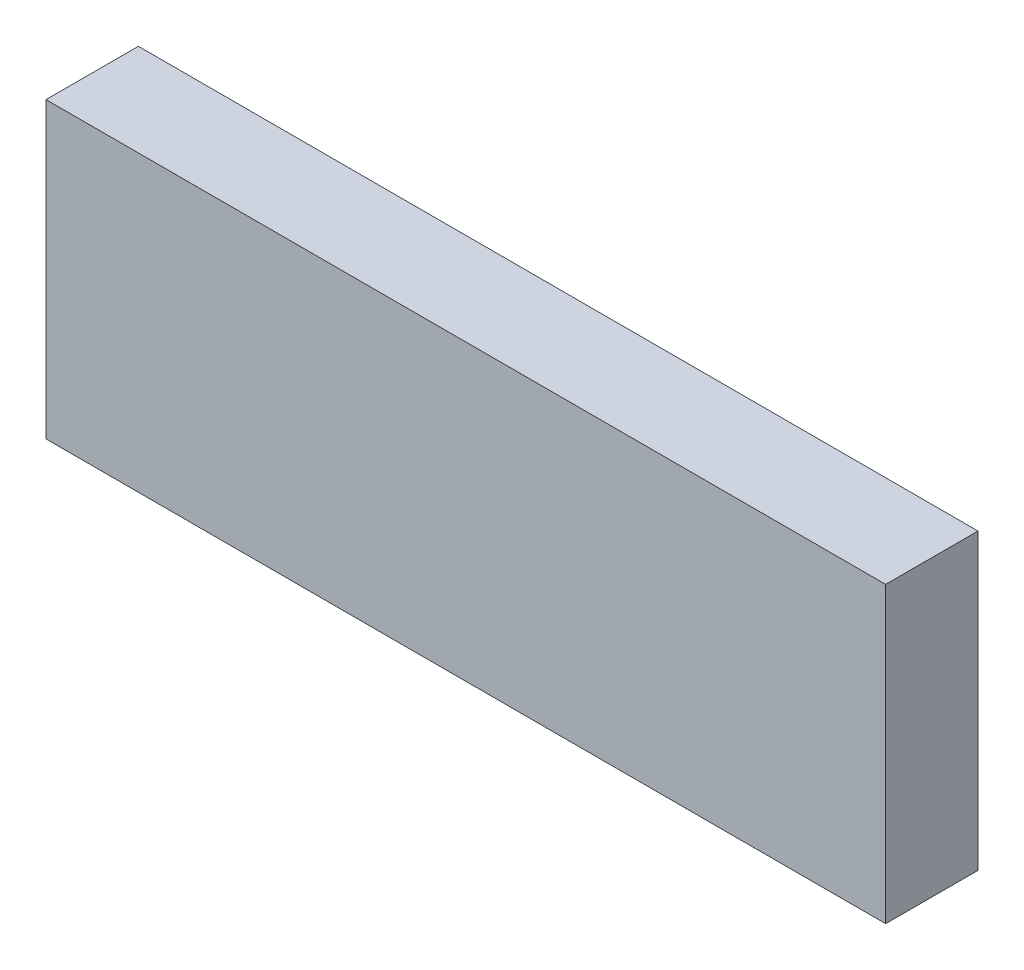
ISO-10303-21;
HEADER;
FILE_DESCRIPTION(('STEP AP214'),'2;1');
FILE_NAME('part.step','',(''),(''),'','','');
FILE_SCHEMA(('AUTOMOTIVE_DESIGN { 1 0 10303 214 1 1 1 1 }'));
ENDSEC;
DATA;
#1=APPLICATION_CONTEXT('core data for automotive mechanical design processes');
#2=APPLICATION_PROTOCOL_DEFINITION('international standard','automotive_design',2000,#1);
#3=PRODUCT_CONTEXT('',#1,'mechanical');
#4=PRODUCT('Part','Part','',(#3));
#5=PRODUCT_RELATED_PRODUCT_CATEGORY('part','',(#4));
#6=PRODUCT_DEFINITION_FORMATION('','',#4);
#7=PRODUCT_DEFINITION_CONTEXT('part definition',#1,'design');
#8=PRODUCT_DEFINITION('design','',#6,#7);
#9=PRODUCT_DEFINITION_SHAPE('','',#8);
#10=(LENGTH_UNIT() NAMED_UNIT(*) SI_UNIT(.MILLI.,.METRE.));
#11=(NAMED_UNIT(*) PLANE_ANGLE_UNIT() SI_UNIT($,.RADIAN.));
#12=(NAMED_UNIT(*) SI_UNIT($,.STERADIAN.) SOLID_ANGLE_UNIT());
#13=UNCERTAINTY_MEASURE_WITH_UNIT(LENGTH_MEASURE(1.E-05),#10,'distance_accuracy_value','');
#14=(GEOMETRIC_REPRESENTATION_CONTEXT(3) GLOBAL_UNCERTAINTY_ASSIGNED_CONTEXT((#13)) GLOBAL_UNIT_ASSIGNED_CONTEXT((#10,
#11,#12)) REPRESENTATION_CONTEXT('',''));
#15=CARTESIAN_POINT('',(0.,0.,0.));
#16=DIRECTION('',(0.,0.,1.));
#17=DIRECTION('',(1.,0.,0.));
#18=AXIS2_PLACEMENT_3D('',#15,#16,#17);
#19=CARTESIAN_POINT('',(100.,35.,22.));
#20=DIRECTION('',(-1.,0.,0.));
#21=DIRECTION('',(0.,0.,1.));
#22=AXIS2_PLACEMENT_3D('',#19,#20,#21);
#23=PLANE('',#22);
#24=DIRECTION('',(0.,1.,0.));
#25=VECTOR('',#24,1.);
#26=CARTESIAN_POINT('',(100.,35.,0.));
#27=LINE('',#26,#25);
#28=CARTESIAN_POINT('',(100.,-35.,0.));
#29=VERTEX_POINT('',#28);
#30=CARTESIAN_POINT('',(100.,35.,0.));
#31=VERTEX_POINT('',#30);
#32=EDGE_CURVE('E95',#29,#31,#27,.T.);
#33=ORIENTED_EDGE('',*,*,#32,.T.);
#34=DIRECTION('',(0.,0.,-1.));
#35=VECTOR('',#34,1.);
#36=CARTESIAN_POINT('',(100.,35.,22.));
#37=LINE('',#36,#35);
#38=CARTESIAN_POINT('',(100.,35.,22.));
#39=VERTEX_POINT('',#38);
#40=EDGE_CURVE('E11',#39,#31,#37,.T.);
#41=ORIENTED_EDGE('',*,*,#40,.F.);
#42=DIRECTION('',(0.,1.,0.));
#43=VECTOR('',#42,1.);
#44=CARTESIAN_POINT('',(100.,35.,22.));
#45=LINE('',#44,#43);
#46=CARTESIAN_POINT('',(100.,-35.,22.));
#47=VERTEX_POINT('',#46);
#48=EDGE_CURVE('E83',#47,#39,#45,.T.);
#49=ORIENTED_EDGE('',*,*,#48,.F.);
#50=DIRECTION('',(0.,0.,-1.));
#51=VECTOR('',#50,1.);
#52=CARTESIAN_POINT('',(100.,-35.,22.));
#53=LINE('',#52,#51);
#54=EDGE_CURVE('E91',#47,#29,#53,.T.);
#55=ORIENTED_EDGE('',*,*,#54,.T.);
#56=EDGE_LOOP('',(#33,#41,#49,#55));
#57=FACE_BOUND('',#56,.T.);
#58=ADVANCED_FACE('F32',(#57),#23,.F.);
#59=CARTESIAN_POINT('',(-100.,35.,22.));
#60=DIRECTION('',(0.,-1.,0.));
#61=DIRECTION('',(0.,0.,-1.));
#62=AXIS2_PLACEMENT_3D('',#59,#60,#61);
#63=PLANE('',#62);
#64=DIRECTION('',(-1.,0.,0.));
#65=VECTOR('',#64,1.);
#66=CARTESIAN_POINT('',(-100.,35.,0.));
#67=LINE('',#66,#65);
#68=CARTESIAN_POINT('',(-100.,35.,0.));
#69=VERTEX_POINT('',#68);
#70=EDGE_CURVE('E87',#31,#69,#67,.T.);
#71=ORIENTED_EDGE('',*,*,#70,.T.);
#72=DIRECTION('',(0.,0.,-1.));
#73=VECTOR('',#72,1.);
#74=CARTESIAN_POINT('',(-100.,35.,22.));
#75=LINE('',#74,#73);
#76=CARTESIAN_POINT('',(-100.,35.,22.));
#77=VERTEX_POINT('',#76);
#78=EDGE_CURVE('E40',#77,#69,#75,.T.);
#79=ORIENTED_EDGE('',*,*,#78,.F.);
#80=DIRECTION('',(-1.,0.,0.));
#81=VECTOR('',#80,1.);
#82=CARTESIAN_POINT('',(-100.,35.,22.));
#83=LINE('',#82,#81);
#84=EDGE_CURVE('E78',#39,#77,#83,.T.);
#85=ORIENTED_EDGE('',*,*,#84,.F.);
#86=ORIENTED_EDGE('',*,*,#40,.T.);
#87=EDGE_LOOP('',(#71,#79,#85,#86));
#88=FACE_BOUND('',#87,.T.);
#89=ADVANCED_FACE('F86',(#88),#63,.F.);
#90=CARTESIAN_POINT('',(-100.,35.,22.));
#91=DIRECTION('',(1.,0.,0.));
#92=DIRECTION('',(0.,1.,0.));
#93=AXIS2_PLACEMENT_3D('',#90,#91,#92);
#94=PLANE('',#93);
#95=DIRECTION('',(0.,-1.,0.));
#96=VECTOR('',#95,1.);
#97=CARTESIAN_POINT('',(-100.,35.,0.));
#98=LINE('',#97,#96);
#99=CARTESIAN_POINT('',(-100.,-35.,0.));
#100=VERTEX_POINT('',#99);
#101=EDGE_CURVE('E65',#69,#100,#98,.T.);
#102=ORIENTED_EDGE('',*,*,#101,.T.);
#103=DIRECTION('',(0.,0.,-1.));
#104=VECTOR('',#103,1.);
#105=CARTESIAN_POINT('',(-100.,-35.,22.));
#106=LINE('',#105,#104);
#107=CARTESIAN_POINT('',(-100.,-35.,22.));
#108=VERTEX_POINT('',#107);
#109=EDGE_CURVE('E88',#108,#100,#106,.T.);
#110=ORIENTED_EDGE('',*,*,#109,.F.);
#111=DIRECTION('',(0.,-1.,0.));
#112=VECTOR('',#111,1.);
#113=CARTESIAN_POINT('',(-100.,35.,22.));
#114=LINE('',#113,#112);
#115=EDGE_CURVE('E81',#77,#108,#114,.T.);
#116=ORIENTED_EDGE('',*,*,#115,.F.);
#117=ORIENTED_EDGE('',*,*,#78,.T.);
#118=EDGE_LOOP('',(#102,#110,#116,#117));
#119=FACE_BOUND('',#118,.T.);
#120=ADVANCED_FACE('F89',(#119),#94,.F.);
#121=CARTESIAN_POINT('',(-100.,-35.,22.));
#122=DIRECTION('',(0.,1.,0.));
#123=DIRECTION('',(0.,0.,1.));
#124=AXIS2_PLACEMENT_3D('',#121,#122,#123);
#125=PLANE('',#124);
#126=DIRECTION('',(1.,0.,0.));
#127=VECTOR('',#126,1.);
#128=CARTESIAN_POINT('',(-100.,-35.,0.));
#129=LINE('',#128,#127);
#130=EDGE_CURVE('E71',#100,#29,#129,.T.);
#131=ORIENTED_EDGE('',*,*,#130,.T.);
#132=ORIENTED_EDGE('',*,*,#54,.F.);
#133=DIRECTION('',(1.,0.,0.));
#134=VECTOR('',#133,1.);
#135=CARTESIAN_POINT('',(-100.,-35.,22.));
#136=LINE('',#135,#134);
#137=EDGE_CURVE('E48',#108,#47,#136,.T.);
#138=ORIENTED_EDGE('',*,*,#137,.F.);
#139=ORIENTED_EDGE('',*,*,#109,.T.);
#140=EDGE_LOOP('',(#131,#132,#138,#139));
#141=FACE_BOUND('',#140,.T.);
#142=ADVANCED_FACE('F102',(#141),#125,.F.);
#143=CARTESIAN_POINT('',(0.,0.,22.));
#144=DIRECTION('',(0.,0.,1.));
#145=DIRECTION('',(1.,0.,0.));
#146=AXIS2_PLACEMENT_3D('',#143,#144,#145);
#147=PLANE('',#146);
#148=ORIENTED_EDGE('',*,*,#48,.T.);
#149=ORIENTED_EDGE('',*,*,#84,.T.);
#150=ORIENTED_EDGE('',*,*,#115,.T.);
#151=ORIENTED_EDGE('',*,*,#137,.T.);
#152=EDGE_LOOP('',(#148,#149,#150,#151));
#153=FACE_BOUND('',#152,.T.);
#154=ADVANCED_FACE('F79',(#153),#147,.T.);
#155=CARTESIAN_POINT('',(0.,0.,0.));
#156=DIRECTION('',(0.,0.,1.));
#157=DIRECTION('',(1.,0.,0.));
#158=AXIS2_PLACEMENT_3D('',#155,#156,#157);
#159=PLANE('',#158);
#160=ORIENTED_EDGE('',*,*,#32,.F.);
#161=ORIENTED_EDGE('',*,*,#130,.F.);
#162=ORIENTED_EDGE('',*,*,#101,.F.);
#163=ORIENTED_EDGE('',*,*,#70,.F.);
#164=EDGE_LOOP('',(#160,#161,#162,#163));
#165=FACE_BOUND('',#164,.T.);
#166=ADVANCED_FACE('F105',(#165),#159,.F.);
#167=CLOSED_SHELL('',(#58,#89,#120,#142,#154,#166));
#168=MANIFOLD_SOLID_BREP('B2',#167);
#169=ADVANCED_BREP_SHAPE_REPRESENTATION('',(#18,#168),#14);
#170=SHAPE_DEFINITION_REPRESENTATION(#9,#169);
ENDSEC;
END-ISO-10303-21;
